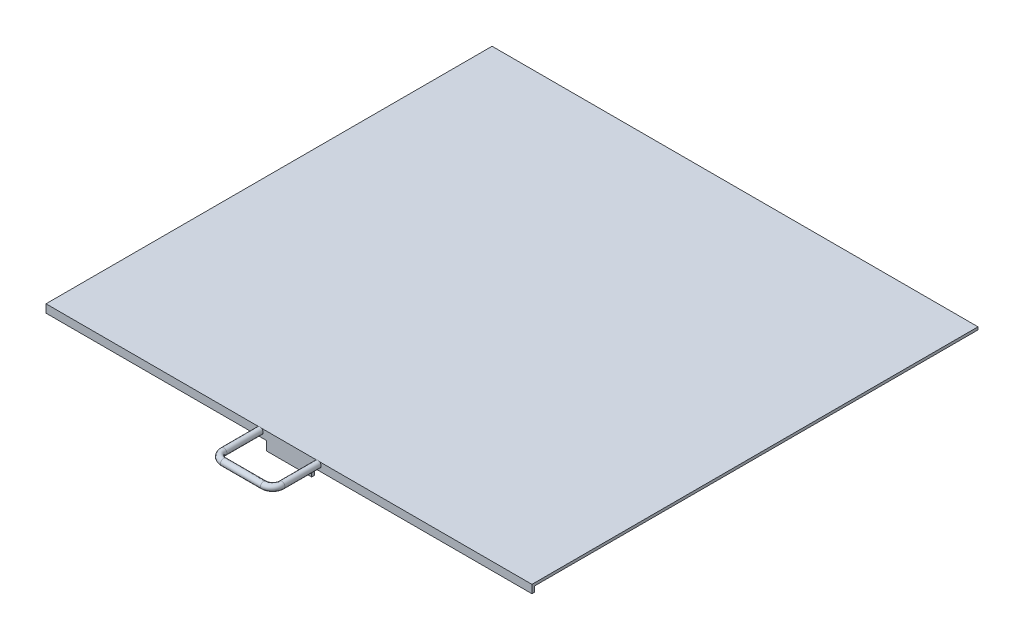
ISO-10303-21;
HEADER;
FILE_DESCRIPTION(('STEP AP214'),'2;1');
FILE_NAME('part.step','',(''),(''),'','','');
FILE_SCHEMA(('AUTOMOTIVE_DESIGN { 1 0 10303 214 1 1 1 1 }'));
ENDSEC;
DATA;
#1=APPLICATION_CONTEXT('core data for automotive mechanical design processes');
#2=APPLICATION_PROTOCOL_DEFINITION('international standard','automotive_design',2000,#1);
#3=PRODUCT_CONTEXT('',#1,'mechanical');
#4=PRODUCT('Part','Part','',(#3));
#5=PRODUCT_RELATED_PRODUCT_CATEGORY('part','',(#4));
#6=PRODUCT_DEFINITION_FORMATION('','',#4);
#7=PRODUCT_DEFINITION_CONTEXT('part definition',#1,'design');
#8=PRODUCT_DEFINITION('design','',#6,#7);
#9=PRODUCT_DEFINITION_SHAPE('','',#8);
#10=(LENGTH_UNIT() NAMED_UNIT(*) SI_UNIT(.MILLI.,.METRE.));
#11=(NAMED_UNIT(*) PLANE_ANGLE_UNIT() SI_UNIT($,.RADIAN.));
#12=(NAMED_UNIT(*) SI_UNIT($,.STERADIAN.) SOLID_ANGLE_UNIT());
#13=UNCERTAINTY_MEASURE_WITH_UNIT(LENGTH_MEASURE(1.E-05),#10,'distance_accuracy_value','');
#14=(GEOMETRIC_REPRESENTATION_CONTEXT(3) GLOBAL_UNCERTAINTY_ASSIGNED_CONTEXT((#13)) GLOBAL_UNIT_ASSIGNED_CONTEXT((#10,
#11,#12)) REPRESENTATION_CONTEXT('',''));
#15=CARTESIAN_POINT('',(0.,0.,0.));
#16=DIRECTION('',(0.,0.,1.));
#17=DIRECTION('',(1.,0.,0.));
#18=AXIS2_PLACEMENT_3D('',#15,#16,#17);
#19=CARTESIAN_POINT('',(-134.,1.5,123.));
#20=DIRECTION('',(0.,0.,-1.));
#21=DIRECTION('',(-1.,0.,0.));
#22=AXIS2_PLACEMENT_3D('',#19,#20,#21);
#23=PLANE('',#22);
#24=DIRECTION('',(1.,0.,0.));
#25=VECTOR('',#24,1.);
#26=CARTESIAN_POINT('',(-134.,1.5,123.));
#27=LINE('',#26,#25);
#28=CARTESIAN_POINT('',(-15.098612181134,1.5,123.));
#29=VERTEX_POINT('',#28);
#30=CARTESIAN_POINT('',(15.098612181134,1.5,123.));
#31=VERTEX_POINT('',#30);
#32=EDGE_CURVE('E142',#29,#31,#27,.T.);
#33=ORIENTED_EDGE('',*,*,#32,.F.);
#34=CARTESIAN_POINT('',(-16.,0.,123.));
#35=DIRECTION('',(0.,0.,-1.));
#36=DIRECTION('',(-1.,0.,0.));
#37=AXIS2_PLACEMENT_3D('',#34,#35,#36);
#38=CIRCLE('',#37,1.75);
#39=CARTESIAN_POINT('',(-16.901387818866,1.5,123.));
#40=VERTEX_POINT('',#39);
#41=EDGE_CURVE('E12',#29,#40,#38,.T.);
#42=ORIENTED_EDGE('',*,*,#41,.T.);
#43=CARTESIAN_POINT('',(-134.,1.5,123.));
#44=VERTEX_POINT('',#43);
#45=EDGE_CURVE('E151',#44,#40,#27,.T.);
#46=ORIENTED_EDGE('',*,*,#45,.F.);
#47=DIRECTION('',(0.,-1.,0.));
#48=VECTOR('',#47,1.);
#49=CARTESIAN_POINT('',(-134.,1.5,123.));
#50=LINE('',#49,#48);
#51=CARTESIAN_POINT('',(-134.,-3.,123.));
#52=VERTEX_POINT('',#51);
#53=EDGE_CURVE('E230',#44,#52,#50,.T.);
#54=ORIENTED_EDGE('',*,*,#53,.T.);
#55=DIRECTION('',(1.,0.,0.));
#56=VECTOR('',#55,1.);
#57=CARTESIAN_POINT('',(-134.,-3.,123.));
#58=LINE('',#57,#56);
#59=CARTESIAN_POINT('',(-12.5,-3.,123.));
#60=VERTEX_POINT('',#59);
#61=EDGE_CURVE('E158',#52,#60,#58,.T.);
#62=ORIENTED_EDGE('',*,*,#61,.T.);
#63=DIRECTION('',(0.,-1.,0.));
#64=VECTOR('',#63,1.);
#65=CARTESIAN_POINT('',(-12.5,-8.,123.));
#66=LINE('',#65,#64);
#67=CARTESIAN_POINT('',(-12.5,-8.,123.));
#68=VERTEX_POINT('',#67);
#69=EDGE_CURVE('E161',#60,#68,#66,.T.);
#70=ORIENTED_EDGE('',*,*,#69,.T.);
#71=DIRECTION('',(1.,0.,0.));
#72=VECTOR('',#71,1.);
#73=CARTESIAN_POINT('',(-12.5,-8.,123.));
#74=LINE('',#73,#72);
#75=CARTESIAN_POINT('',(12.5,-8.,123.));
#76=VERTEX_POINT('',#75);
#77=EDGE_CURVE('E195',#68,#76,#74,.T.);
#78=ORIENTED_EDGE('',*,*,#77,.T.);
#79=DIRECTION('',(0.,1.,0.));
#80=VECTOR('',#79,1.);
#81=CARTESIAN_POINT('',(12.5,-8.,123.));
#82=LINE('',#81,#80);
#83=CARTESIAN_POINT('',(12.5,-3.,123.));
#84=VERTEX_POINT('',#83);
#85=EDGE_CURVE('E198',#76,#84,#82,.T.);
#86=ORIENTED_EDGE('',*,*,#85,.T.);
#87=DIRECTION('',(1.,0.,0.));
#88=VECTOR('',#87,1.);
#89=CARTESIAN_POINT('',(12.5,-3.,123.));
#90=LINE('',#89,#88);
#91=CARTESIAN_POINT('',(134.,-3.,123.));
#92=VERTEX_POINT('',#91);
#93=EDGE_CURVE('E172',#84,#92,#90,.T.);
#94=ORIENTED_EDGE('',*,*,#93,.T.);
#95=DIRECTION('',(0.,-1.,0.));
#96=VECTOR('',#95,1.);
#97=CARTESIAN_POINT('',(134.,1.5,123.));
#98=LINE('',#97,#96);
#99=CARTESIAN_POINT('',(134.,1.5,123.));
#100=VERTEX_POINT('',#99);
#101=EDGE_CURVE('E148',#100,#92,#98,.T.);
#102=ORIENTED_EDGE('',*,*,#101,.F.);
#103=CARTESIAN_POINT('',(16.901387818866,1.5,123.));
#104=VERTEX_POINT('',#103);
#105=EDGE_CURVE('E139',#104,#100,#27,.T.);
#106=ORIENTED_EDGE('',*,*,#105,.F.);
#107=CARTESIAN_POINT('',(16.,0.,123.));
#108=DIRECTION('',(0.,0.,1.));
#109=DIRECTION('',(1.,0.,0.));
#110=AXIS2_PLACEMENT_3D('',#107,#108,#109);
#111=CIRCLE('',#110,1.75);
#112=EDGE_CURVE('E54',#31,#104,#111,.T.);
#113=ORIENTED_EDGE('',*,*,#112,.F.);
#114=EDGE_LOOP('',(#33,#42,#46,#54,#62,#70,#78,#86,#94,#102,#106,#113));
#115=FACE_BOUND('',#114,.T.);
#116=ADVANCED_FACE('F45',(#115),#23,.F.);
#117=CARTESIAN_POINT('',(0.,0.,0.));
#118=DIRECTION('',(0.,-1.,0.));
#119=DIRECTION('',(0.,0.,-1.));
#120=AXIS2_PLACEMENT_3D('',#117,#118,#119);
#121=PLANE('',#120);
#122=DIRECTION('',(0.,0.,-1.));
#123=VECTOR('',#122,1.);
#124=CARTESIAN_POINT('',(134.,0.,123.));
#125=LINE('',#124,#123);
#126=CARTESIAN_POINT('',(134.,0.,121.5));
#127=VERTEX_POINT('',#126);
#128=CARTESIAN_POINT('',(134.,0.,-123.));
#129=VERTEX_POINT('',#128);
#130=EDGE_CURVE('E205',#127,#129,#125,.T.);
#131=ORIENTED_EDGE('',*,*,#130,.F.);
#132=DIRECTION('',(-1.,0.,0.));
#133=VECTOR('',#132,1.);
#134=CARTESIAN_POINT('',(-134.,0.,121.5));
#135=LINE('',#134,#133);
#136=CARTESIAN_POINT('',(-134.,0.,121.5));
#137=VERTEX_POINT('',#136);
#138=EDGE_CURVE('E189',#127,#137,#135,.T.);
#139=ORIENTED_EDGE('',*,*,#138,.T.);
#140=DIRECTION('',(0.,0.,1.));
#141=VECTOR('',#140,1.);
#142=CARTESIAN_POINT('',(-134.,0.,123.));
#143=LINE('',#142,#141);
#144=CARTESIAN_POINT('',(-134.,0.,-123.));
#145=VERTEX_POINT('',#144);
#146=EDGE_CURVE('E219',#145,#137,#143,.T.);
#147=ORIENTED_EDGE('',*,*,#146,.F.);
#148=DIRECTION('',(-1.,0.,0.));
#149=VECTOR('',#148,1.);
#150=CARTESIAN_POINT('',(-134.,0.,-123.));
#151=LINE('',#150,#149);
#152=EDGE_CURVE('E225',#129,#145,#151,.T.);
#153=ORIENTED_EDGE('',*,*,#152,.F.);
#154=EDGE_LOOP('',(#131,#139,#147,#153));
#155=FACE_BOUND('',#154,.T.);
#156=ADVANCED_FACE('F247',(#155),#121,.T.);
#157=CARTESIAN_POINT('',(134.,1.5,123.));
#158=DIRECTION('',(-1.,0.,0.));
#159=DIRECTION('',(0.,0.,1.));
#160=AXIS2_PLACEMENT_3D('',#157,#158,#159);
#161=PLANE('',#160);
#162=ORIENTED_EDGE('',*,*,#101,.T.);
#163=DIRECTION('',(0.,0.,1.));
#164=VECTOR('',#163,1.);
#165=CARTESIAN_POINT('',(134.,-3.,121.5));
#166=LINE('',#165,#164);
#167=CARTESIAN_POINT('',(134.,-3.,121.5));
#168=VERTEX_POINT('',#167);
#169=EDGE_CURVE('E202',#168,#92,#166,.T.);
#170=ORIENTED_EDGE('',*,*,#169,.F.);
#171=DIRECTION('',(0.,1.,0.));
#172=VECTOR('',#171,1.);
#173=CARTESIAN_POINT('',(134.,0.,121.5));
#174=LINE('',#173,#172);
#175=EDGE_CURVE('E187',#168,#127,#174,.T.);
#176=ORIENTED_EDGE('',*,*,#175,.T.);
#177=ORIENTED_EDGE('',*,*,#130,.T.);
#178=DIRECTION('',(0.,-1.,0.));
#179=VECTOR('',#178,1.);
#180=CARTESIAN_POINT('',(134.,1.5,-123.));
#181=LINE('',#180,#179);
#182=CARTESIAN_POINT('',(134.,1.5,-123.));
#183=VERTEX_POINT('',#182);
#184=EDGE_CURVE('E49',#183,#129,#181,.T.);
#185=ORIENTED_EDGE('',*,*,#184,.F.);
#186=DIRECTION('',(0.,0.,-1.));
#187=VECTOR('',#186,1.);
#188=CARTESIAN_POINT('',(134.,1.5,123.));
#189=LINE('',#188,#187);
#190=EDGE_CURVE('E216',#100,#183,#189,.T.);
#191=ORIENTED_EDGE('',*,*,#190,.F.);
#192=EDGE_LOOP('',(#162,#170,#176,#177,#185,#191));
#193=FACE_BOUND('',#192,.T.);
#194=ADVANCED_FACE('F47',(#193),#161,.F.);
#195=CARTESIAN_POINT('',(-134.,1.5,-123.));
#196=DIRECTION('',(0.,0.,1.));
#197=DIRECTION('',(1.,0.,0.));
#198=AXIS2_PLACEMENT_3D('',#195,#196,#197);
#199=PLANE('',#198);
#200=ORIENTED_EDGE('',*,*,#152,.T.);
#201=DIRECTION('',(0.,-1.,0.));
#202=VECTOR('',#201,1.);
#203=CARTESIAN_POINT('',(-134.,1.5,-123.));
#204=LINE('',#203,#202);
#205=CARTESIAN_POINT('',(-134.,1.5,-123.));
#206=VERTEX_POINT('',#205);
#207=EDGE_CURVE('E231',#206,#145,#204,.T.);
#208=ORIENTED_EDGE('',*,*,#207,.F.);
#209=DIRECTION('',(-1.,0.,0.));
#210=VECTOR('',#209,1.);
#211=CARTESIAN_POINT('',(-134.,1.5,-123.));
#212=LINE('',#211,#210);
#213=EDGE_CURVE('E218',#183,#206,#212,.T.);
#214=ORIENTED_EDGE('',*,*,#213,.F.);
#215=ORIENTED_EDGE('',*,*,#184,.T.);
#216=EDGE_LOOP('',(#200,#208,#214,#215));
#217=FACE_BOUND('',#216,.T.);
#218=ADVANCED_FACE('F240',(#217),#199,.F.);
#219=CARTESIAN_POINT('',(-134.,1.5,123.));
#220=DIRECTION('',(1.,0.,0.));
#221=DIRECTION('',(0.,0.,-1.));
#222=AXIS2_PLACEMENT_3D('',#219,#220,#221);
#223=PLANE('',#222);
#224=ORIENTED_EDGE('',*,*,#146,.T.);
#225=DIRECTION('',(0.,-1.,0.));
#226=VECTOR('',#225,1.);
#227=CARTESIAN_POINT('',(-134.,0.,121.5));
#228=LINE('',#227,#226);
#229=CARTESIAN_POINT('',(-134.,-3.,121.5));
#230=VERTEX_POINT('',#229);
#231=EDGE_CURVE('E168',#137,#230,#228,.T.);
#232=ORIENTED_EDGE('',*,*,#231,.T.);
#233=DIRECTION('',(0.,0.,1.));
#234=VECTOR('',#233,1.);
#235=CARTESIAN_POINT('',(-134.,-3.,121.5));
#236=LINE('',#235,#234);
#237=EDGE_CURVE('E191',#230,#52,#236,.T.);
#238=ORIENTED_EDGE('',*,*,#237,.T.);
#239=ORIENTED_EDGE('',*,*,#53,.F.);
#240=DIRECTION('',(0.,0.,1.));
#241=VECTOR('',#240,1.);
#242=CARTESIAN_POINT('',(-134.,1.5,123.));
#243=LINE('',#242,#241);
#244=EDGE_CURVE('E150',#206,#44,#243,.T.);
#245=ORIENTED_EDGE('',*,*,#244,.F.);
#246=ORIENTED_EDGE('',*,*,#207,.T.);
#247=EDGE_LOOP('',(#224,#232,#238,#239,#245,#246));
#248=FACE_BOUND('',#247,.T.);
#249=ADVANCED_FACE('F248',(#248),#223,.F.);
#250=CARTESIAN_POINT('',(0.,1.5,0.));
#251=DIRECTION('',(0.,-1.,0.));
#252=DIRECTION('',(0.,0.,-1.));
#253=AXIS2_PLACEMENT_3D('',#250,#251,#252);
#254=PLANE('',#253);
#255=ORIENTED_EDGE('',*,*,#190,.T.);
#256=ORIENTED_EDGE('',*,*,#213,.T.);
#257=ORIENTED_EDGE('',*,*,#244,.T.);
#258=ORIENTED_EDGE('',*,*,#45,.T.);
#259=EDGE_CURVE('E223',#40,#29,#27,.T.);
#260=ORIENTED_EDGE('',*,*,#259,.T.);
#261=ORIENTED_EDGE('',*,*,#32,.T.);
#262=EDGE_CURVE('E136',#31,#104,#27,.T.);
#263=ORIENTED_EDGE('',*,*,#262,.T.);
#264=ORIENTED_EDGE('',*,*,#105,.T.);
#265=EDGE_LOOP('',(#255,#256,#257,#258,#260,#261,#263,#264));
#266=FACE_BOUND('',#265,.T.);
#267=ADVANCED_FACE('F138',(#266),#254,.F.);
#268=CARTESIAN_POINT('',(12.5,-3.,121.5));
#269=DIRECTION('',(0.,-1.,0.));
#270=DIRECTION('',(0.,0.,-1.));
#271=AXIS2_PLACEMENT_3D('',#268,#269,#270);
#272=PLANE('',#271);
#273=ORIENTED_EDGE('',*,*,#93,.F.);
#274=DIRECTION('',(0.,0.,1.));
#275=VECTOR('',#274,1.);
#276=CARTESIAN_POINT('',(12.5,-3.,121.5));
#277=LINE('',#276,#275);
#278=CARTESIAN_POINT('',(12.5,-3.,121.5));
#279=VERTEX_POINT('',#278);
#280=EDGE_CURVE('E206',#279,#84,#277,.T.);
#281=ORIENTED_EDGE('',*,*,#280,.F.);
#282=DIRECTION('',(1.,0.,0.));
#283=VECTOR('',#282,1.);
#284=CARTESIAN_POINT('',(12.5,-3.,121.5));
#285=LINE('',#284,#283);
#286=EDGE_CURVE('E184',#279,#168,#285,.T.);
#287=ORIENTED_EDGE('',*,*,#286,.T.);
#288=ORIENTED_EDGE('',*,*,#169,.T.);
#289=EDGE_LOOP('',(#273,#281,#287,#288));
#290=FACE_BOUND('',#289,.T.);
#291=ADVANCED_FACE('F319',(#290),#272,.T.);
#292=CARTESIAN_POINT('',(12.5,-8.,121.5));
#293=DIRECTION('',(1.,0.,0.));
#294=DIRECTION('',(0.,0.,-1.));
#295=AXIS2_PLACEMENT_3D('',#292,#293,#294);
#296=PLANE('',#295);
#297=ORIENTED_EDGE('',*,*,#85,.F.);
#298=DIRECTION('',(0.,0.,1.));
#299=VECTOR('',#298,1.);
#300=CARTESIAN_POINT('',(12.5,-8.,121.5));
#301=LINE('',#300,#299);
#302=CARTESIAN_POINT('',(12.5,-8.,121.5));
#303=VERTEX_POINT('',#302);
#304=EDGE_CURVE('E208',#303,#76,#301,.T.);
#305=ORIENTED_EDGE('',*,*,#304,.F.);
#306=DIRECTION('',(0.,1.,0.));
#307=VECTOR('',#306,1.);
#308=CARTESIAN_POINT('',(12.5,-8.,121.5));
#309=LINE('',#308,#307);
#310=EDGE_CURVE('E181',#303,#279,#309,.T.);
#311=ORIENTED_EDGE('',*,*,#310,.T.);
#312=ORIENTED_EDGE('',*,*,#280,.T.);
#313=EDGE_LOOP('',(#297,#305,#311,#312));
#314=FACE_BOUND('',#313,.T.);
#315=ADVANCED_FACE('F381',(#314),#296,.T.);
#316=CARTESIAN_POINT('',(-12.5,-8.,121.5));
#317=DIRECTION('',(0.,-1.,0.));
#318=DIRECTION('',(0.,0.,-1.));
#319=AXIS2_PLACEMENT_3D('',#316,#317,#318);
#320=PLANE('',#319);
#321=ORIENTED_EDGE('',*,*,#77,.F.);
#322=DIRECTION('',(0.,0.,1.));
#323=VECTOR('',#322,1.);
#324=CARTESIAN_POINT('',(-12.5,-8.,121.5));
#325=LINE('',#324,#323);
#326=CARTESIAN_POINT('',(-12.5,-8.,121.5));
#327=VERTEX_POINT('',#326);
#328=EDGE_CURVE('E210',#327,#68,#325,.T.);
#329=ORIENTED_EDGE('',*,*,#328,.F.);
#330=DIRECTION('',(1.,0.,0.));
#331=VECTOR('',#330,1.);
#332=CARTESIAN_POINT('',(-12.5,-8.,121.5));
#333=LINE('',#332,#331);
#334=EDGE_CURVE('E178',#327,#303,#333,.T.);
#335=ORIENTED_EDGE('',*,*,#334,.T.);
#336=ORIENTED_EDGE('',*,*,#304,.T.);
#337=EDGE_LOOP('',(#321,#329,#335,#336));
#338=FACE_BOUND('',#337,.T.);
#339=ADVANCED_FACE('F385',(#338),#320,.T.);
#340=CARTESIAN_POINT('',(-12.5,-8.,121.5));
#341=DIRECTION('',(-1.,0.,0.));
#342=DIRECTION('',(0.,0.,1.));
#343=AXIS2_PLACEMENT_3D('',#340,#341,#342);
#344=PLANE('',#343);
#345=ORIENTED_EDGE('',*,*,#69,.F.);
#346=DIRECTION('',(0.,0.,1.));
#347=VECTOR('',#346,1.);
#348=CARTESIAN_POINT('',(-12.5,-3.,121.5));
#349=LINE('',#348,#347);
#350=CARTESIAN_POINT('',(-12.5,-3.,121.5));
#351=VERTEX_POINT('',#350);
#352=EDGE_CURVE('E212',#351,#60,#349,.T.);
#353=ORIENTED_EDGE('',*,*,#352,.F.);
#354=DIRECTION('',(0.,-1.,0.));
#355=VECTOR('',#354,1.);
#356=CARTESIAN_POINT('',(-12.5,-8.,121.5));
#357=LINE('',#356,#355);
#358=EDGE_CURVE('E175',#351,#327,#357,.T.);
#359=ORIENTED_EDGE('',*,*,#358,.T.);
#360=ORIENTED_EDGE('',*,*,#328,.T.);
#361=EDGE_LOOP('',(#345,#353,#359,#360));
#362=FACE_BOUND('',#361,.T.);
#363=ADVANCED_FACE('F389',(#362),#344,.T.);
#364=CARTESIAN_POINT('',(-134.,-3.,121.5));
#365=DIRECTION('',(0.,-1.,0.));
#366=DIRECTION('',(0.,0.,-1.));
#367=AXIS2_PLACEMENT_3D('',#364,#365,#366);
#368=PLANE('',#367);
#369=ORIENTED_EDGE('',*,*,#61,.F.);
#370=ORIENTED_EDGE('',*,*,#237,.F.);
#371=DIRECTION('',(1.,0.,0.));
#372=VECTOR('',#371,1.);
#373=CARTESIAN_POINT('',(-134.,-3.,121.5));
#374=LINE('',#373,#372);
#375=EDGE_CURVE('E171',#230,#351,#374,.T.);
#376=ORIENTED_EDGE('',*,*,#375,.T.);
#377=ORIENTED_EDGE('',*,*,#352,.T.);
#378=EDGE_LOOP('',(#369,#370,#376,#377));
#379=FACE_BOUND('',#378,.T.);
#380=ADVANCED_FACE('F257',(#379),#368,.T.);
#381=CARTESIAN_POINT('',(0.,0.,121.5));
#382=DIRECTION('',(0.,0.,1.));
#383=DIRECTION('',(1.,0.,0.));
#384=AXIS2_PLACEMENT_3D('',#381,#382,#383);
#385=PLANE('',#384);
#386=ORIENTED_EDGE('',*,*,#231,.F.);
#387=ORIENTED_EDGE('',*,*,#138,.F.);
#388=ORIENTED_EDGE('',*,*,#175,.F.);
#389=ORIENTED_EDGE('',*,*,#286,.F.);
#390=ORIENTED_EDGE('',*,*,#310,.F.);
#391=ORIENTED_EDGE('',*,*,#334,.F.);
#392=ORIENTED_EDGE('',*,*,#358,.F.);
#393=ORIENTED_EDGE('',*,*,#375,.F.);
#394=EDGE_LOOP('',(#386,#387,#388,#389,#390,#391,#392,#393));
#395=FACE_BOUND('',#394,.T.);
#396=ADVANCED_FACE('F253',(#395),#385,.F.);
#397=CARTESIAN_POINT('',(-16.,0.,123.));
#398=DIRECTION('',(0.,0.,-1.));
#399=DIRECTION('',(-1.,0.,0.));
#400=AXIS2_PLACEMENT_3D('',#397,#398,#399);
#401=PLANE('',#400);
#402=ORIENTED_EDGE('',*,*,#259,.F.);
#403=EDGE_CURVE('E56',#40,#29,#38,.T.);
#404=ORIENTED_EDGE('',*,*,#403,.T.);
#405=EDGE_LOOP('',(#402,#404));
#406=FACE_BOUND('',#405,.T.);
#407=ADVANCED_FACE('F261',(#406),#401,.T.);
#408=CARTESIAN_POINT('',(16.,0.,123.));
#409=DIRECTION('',(0.,0.,1.));
#410=DIRECTION('',(1.,0.,0.));
#411=AXIS2_PLACEMENT_3D('',#408,#409,#410);
#412=PLANE('',#411);
#413=ORIENTED_EDGE('',*,*,#262,.F.);
#414=EDGE_CURVE('E155',#104,#31,#111,.T.);
#415=ORIENTED_EDGE('',*,*,#414,.F.);
#416=EDGE_LOOP('',(#413,#415));
#417=FACE_BOUND('',#416,.T.);
#418=ADVANCED_FACE('F157',(#417),#412,.F.);
#419=CARTESIAN_POINT('',(-16.,0.,123.));
#420=DIRECTION('',(0.,0.,1.));
#421=DIRECTION('',(1.,0.,0.));
#422=AXIS2_PLACEMENT_3D('',#419,#420,#421);
#423=CYLINDRICAL_SURFACE('',#422,1.75);
#424=CARTESIAN_POINT('',(-16.,0.,143.));
#425=DIRECTION('',(0.,0.,-1.));
#426=DIRECTION('',(-1.,0.,0.));
#427=AXIS2_PLACEMENT_3D('',#424,#425,#426);
#428=CIRCLE('',#427,1.75);
#429=CARTESIAN_POINT('',(-17.75,0.,143.));
#430=VERTEX_POINT('',#429);
#431=EDGE_CURVE('E447',#430,#430,#428,.T.);
#432=ORIENTED_EDGE('',*,*,#431,.T.);
#433=EDGE_LOOP('',(#432));
#434=FACE_BOUND('',#433,.T.);
#435=ORIENTED_EDGE('',*,*,#403,.F.);
#436=ORIENTED_EDGE('',*,*,#41,.F.);
#437=EDGE_LOOP('',(#435,#436));
#438=FACE_BOUND('',#437,.T.);
#439=ADVANCED_FACE('F262',(#434,#438),#423,.T.);
#440=CARTESIAN_POINT('',(-11.,0.,143.));
#441=DIRECTION('',(0.,1.,0.));
#442=DIRECTION('',(0.,0.,1.));
#443=AXIS2_PLACEMENT_3D('',#440,#441,#442);
#444=TOROIDAL_SURFACE('',#443,5.,1.75);
#445=CARTESIAN_POINT('',(-11.,0.,148.));
#446=DIRECTION('',(-1.,0.,0.));
#447=DIRECTION('',(0.,0.,1.));
#448=AXIS2_PLACEMENT_3D('',#445,#446,#447);
#449=CIRCLE('',#448,1.75);
#450=CARTESIAN_POINT('',(-11.,0.,149.75));
#451=VERTEX_POINT('',#450);
#452=EDGE_CURVE('E445',#451,#451,#449,.T.);
#453=CARTESIAN_POINT('',(-11.,0.,143.));
#454=DIRECTION('',(0.,1.,0.));
#455=DIRECTION('',(0.,0.,1.));
#456=AXIS2_PLACEMENT_3D('',#453,#454,#455);
#457=CIRCLE('',#456,6.75);
#458=EDGE_CURVE('',#430,#451,#457,.T.);
#459=ORIENTED_EDGE('',*,*,#431,.F.);
#460=ORIENTED_EDGE('',*,*,#452,.T.);
#461=ORIENTED_EDGE('',*,*,#458,.T.);
#462=ORIENTED_EDGE('',*,*,#458,.F.);
#463=EDGE_LOOP('',(#459,#461,#460,#462));
#464=FACE_BOUND('',#463,.T.);
#465=ADVANCED_FACE('F264',(#464),#444,.T.);
#466=CARTESIAN_POINT('',(-11.,0.,148.));
#467=DIRECTION('',(1.,0.,0.));
#468=DIRECTION('',(0.,0.,-1.));
#469=AXIS2_PLACEMENT_3D('',#466,#467,#468);
#470=CYLINDRICAL_SURFACE('',#469,1.75);
#471=CARTESIAN_POINT('',(11.,0.,148.));
#472=DIRECTION('',(-1.,0.,0.));
#473=DIRECTION('',(0.,0.,1.));
#474=AXIS2_PLACEMENT_3D('',#471,#472,#473);
#475=CIRCLE('',#474,1.75);
#476=CARTESIAN_POINT('',(11.,0.,149.75));
#477=VERTEX_POINT('',#476);
#478=EDGE_CURVE('E164',#477,#477,#475,.T.);
#479=ORIENTED_EDGE('',*,*,#478,.T.);
#480=EDGE_LOOP('',(#479));
#481=FACE_BOUND('',#480,.T.);
#482=ORIENTED_EDGE('',*,*,#452,.F.);
#483=EDGE_LOOP('',(#482));
#484=FACE_BOUND('',#483,.T.);
#485=ADVANCED_FACE('F271',(#481,#484),#470,.T.);
#486=CARTESIAN_POINT('',(11.,0.,143.));
#487=DIRECTION('',(0.,1.,0.));
#488=DIRECTION('',(0.,0.,1.));
#489=AXIS2_PLACEMENT_3D('',#486,#487,#488);
#490=TOROIDAL_SURFACE('',#489,5.,1.75);
#491=CARTESIAN_POINT('',(16.,0.,143.));
#492=DIRECTION('',(0.,0.,1.));
#493=DIRECTION('',(1.,0.,0.));
#494=AXIS2_PLACEMENT_3D('',#491,#492,#493);
#495=CIRCLE('',#494,1.75);
#496=CARTESIAN_POINT('',(17.75,0.,143.));
#497=VERTEX_POINT('',#496);
#498=EDGE_CURVE('E159',#497,#497,#495,.T.);
#499=CARTESIAN_POINT('',(11.,0.,143.));
#500=DIRECTION('',(0.,1.,0.));
#501=DIRECTION('',(0.,0.,1.));
#502=AXIS2_PLACEMENT_3D('',#499,#500,#501);
#503=CIRCLE('',#502,6.75000000000001);
#504=EDGE_CURVE('',#477,#497,#503,.T.);
#505=ORIENTED_EDGE('',*,*,#478,.F.);
#506=ORIENTED_EDGE('',*,*,#498,.T.);
#507=ORIENTED_EDGE('',*,*,#504,.T.);
#508=ORIENTED_EDGE('',*,*,#504,.F.);
#509=EDGE_LOOP('',(#505,#507,#506,#508));
#510=FACE_BOUND('',#509,.T.);
#511=ADVANCED_FACE('F356',(#510),#490,.T.);
#512=CARTESIAN_POINT('',(16.,0.,143.));
#513=DIRECTION('',(0.,0.,-1.));
#514=DIRECTION('',(-1.,0.,0.));
#515=AXIS2_PLACEMENT_3D('',#512,#513,#514);
#516=CYLINDRICAL_SURFACE('',#515,1.75);
#517=ORIENTED_EDGE('',*,*,#414,.T.);
#518=ORIENTED_EDGE('',*,*,#112,.T.);
#519=EDGE_LOOP('',(#517,#518));
#520=FACE_BOUND('',#519,.T.);
#521=ORIENTED_EDGE('',*,*,#498,.F.);
#522=EDGE_LOOP('',(#521));
#523=FACE_BOUND('',#522,.T.);
#524=ADVANCED_FACE('F153',(#520,#523),#516,.T.);
#525=CLOSED_SHELL('',(#116,#156,#194,#218,#249,#267,#291,#315,#339,#363,#380,#396,#407,#418,
#439,#465,#485,#511,#524));
#526=MANIFOLD_SOLID_BREP('B2',#525);
#527=ADVANCED_BREP_SHAPE_REPRESENTATION('',(#18,#526),#14);
#528=SHAPE_DEFINITION_REPRESENTATION(#9,#527);
ENDSEC;
END-ISO-10303-21;
